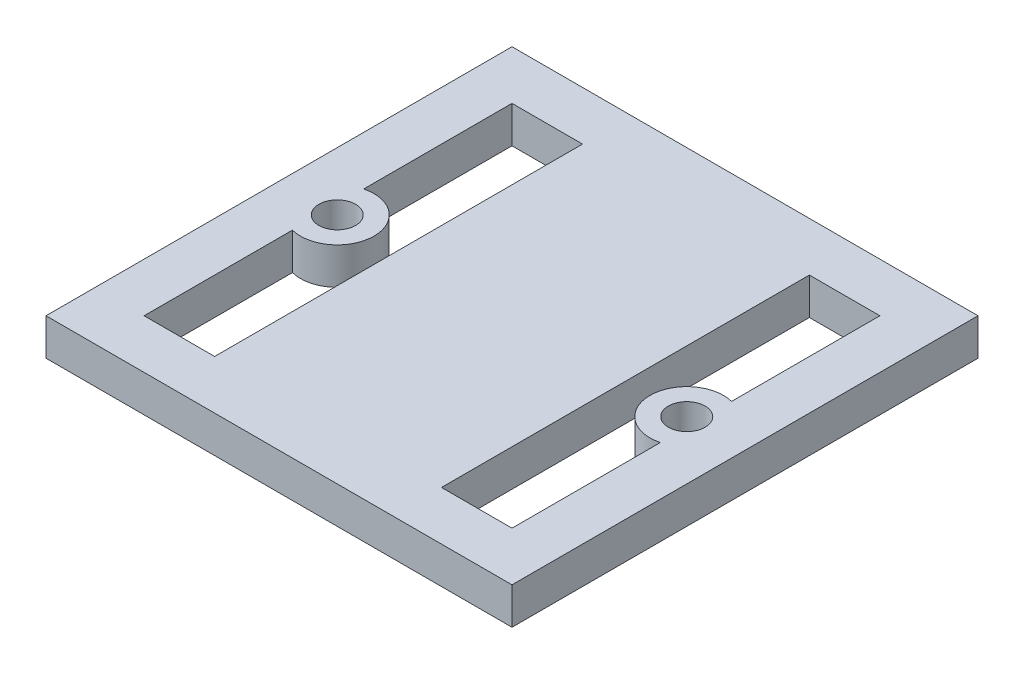
ISO-10303-21;
HEADER;
FILE_DESCRIPTION(('STEP AP214'),'2;1');
FILE_NAME('part.step','',(''),(''),'','','');
FILE_SCHEMA(('AUTOMOTIVE_DESIGN { 1 0 10303 214 1 1 1 1 }'));
ENDSEC;
DATA;
#1=APPLICATION_CONTEXT('core data for automotive mechanical design processes');
#2=APPLICATION_PROTOCOL_DEFINITION('international standard','automotive_design',2000,#1);
#3=PRODUCT_CONTEXT('',#1,'mechanical');
#4=PRODUCT('Part','Part','',(#3));
#5=PRODUCT_RELATED_PRODUCT_CATEGORY('part','',(#4));
#6=PRODUCT_DEFINITION_FORMATION('','',#4);
#7=PRODUCT_DEFINITION_CONTEXT('part definition',#1,'design');
#8=PRODUCT_DEFINITION('design','',#6,#7);
#9=PRODUCT_DEFINITION_SHAPE('','',#8);
#10=(LENGTH_UNIT() NAMED_UNIT(*) SI_UNIT(.MILLI.,.METRE.));
#11=(NAMED_UNIT(*) PLANE_ANGLE_UNIT() SI_UNIT($,.RADIAN.));
#12=(NAMED_UNIT(*) SI_UNIT($,.STERADIAN.) SOLID_ANGLE_UNIT());
#13=UNCERTAINTY_MEASURE_WITH_UNIT(LENGTH_MEASURE(1.E-05),#10,'distance_accuracy_value','');
#14=(GEOMETRIC_REPRESENTATION_CONTEXT(3) GLOBAL_UNCERTAINTY_ASSIGNED_CONTEXT((#13)) GLOBAL_UNIT_ASSIGNED_CONTEXT((#10,
#11,#12)) REPRESENTATION_CONTEXT('',''));
#15=CARTESIAN_POINT('',(0.,0.,0.));
#16=DIRECTION('',(0.,0.,1.));
#17=DIRECTION('',(1.,0.,0.));
#18=AXIS2_PLACEMENT_3D('',#15,#16,#17);
#19=CARTESIAN_POINT('',(0.,3.,19.));
#20=DIRECTION('',(0.,0.,-1.));
#21=DIRECTION('',(-1.,0.,0.));
#22=AXIS2_PLACEMENT_3D('',#19,#20,#21);
#23=PLANE('',#22);
#24=DIRECTION('',(1.,0.,0.));
#25=VECTOR('',#24,1.);
#26=CARTESIAN_POINT('',(0.,0.,19.));
#27=LINE('',#26,#25);
#28=CARTESIAN_POINT('',(-19.,0.,19.));
#29=VERTEX_POINT('',#28);
#30=CARTESIAN_POINT('',(19.,0.,19.));
#31=VERTEX_POINT('',#30);
#32=EDGE_CURVE('E237',#29,#31,#27,.T.);
#33=ORIENTED_EDGE('',*,*,#32,.T.);
#34=DIRECTION('',(0.,-1.,0.));
#35=VECTOR('',#34,1.);
#36=CARTESIAN_POINT('',(19.,3.,19.));
#37=LINE('',#36,#35);
#38=CARTESIAN_POINT('',(19.,3.,19.));
#39=VERTEX_POINT('',#38);
#40=EDGE_CURVE('E11',#39,#31,#37,.T.);
#41=ORIENTED_EDGE('',*,*,#40,.F.);
#42=DIRECTION('',(1.,0.,0.));
#43=VECTOR('',#42,1.);
#44=CARTESIAN_POINT('',(0.,3.,19.));
#45=LINE('',#44,#43);
#46=CARTESIAN_POINT('',(-19.,3.,19.));
#47=VERTEX_POINT('',#46);
#48=EDGE_CURVE('E173',#47,#39,#45,.T.);
#49=ORIENTED_EDGE('',*,*,#48,.F.);
#50=DIRECTION('',(0.,-1.,0.));
#51=VECTOR('',#50,1.);
#52=CARTESIAN_POINT('',(-19.,3.,19.));
#53=LINE('',#52,#51);
#54=EDGE_CURVE('E64',#47,#29,#53,.T.);
#55=ORIENTED_EDGE('',*,*,#54,.T.);
#56=EDGE_LOOP('',(#33,#41,#49,#55));
#57=FACE_BOUND('',#56,.T.);
#58=ADVANCED_FACE('F44',(#57),#23,.F.);
#59=CARTESIAN_POINT('',(19.,3.,0.));
#60=DIRECTION('',(-1.,0.,0.));
#61=DIRECTION('',(0.,0.,1.));
#62=AXIS2_PLACEMENT_3D('',#59,#60,#61);
#63=PLANE('',#62);
#64=DIRECTION('',(0.,0.,-1.));
#65=VECTOR('',#64,1.);
#66=CARTESIAN_POINT('',(19.,0.,0.));
#67=LINE('',#66,#65);
#68=CARTESIAN_POINT('',(19.,0.,-19.));
#69=VERTEX_POINT('',#68);
#70=EDGE_CURVE('E180',#31,#69,#67,.T.);
#71=ORIENTED_EDGE('',*,*,#70,.T.);
#72=DIRECTION('',(0.,-1.,0.));
#73=VECTOR('',#72,1.);
#74=CARTESIAN_POINT('',(19.,3.,-19.));
#75=LINE('',#74,#73);
#76=CARTESIAN_POINT('',(19.,3.,-19.));
#77=VERTEX_POINT('',#76);
#78=EDGE_CURVE('E55',#77,#69,#75,.T.);
#79=ORIENTED_EDGE('',*,*,#78,.F.);
#80=DIRECTION('',(0.,0.,-1.));
#81=VECTOR('',#80,1.);
#82=CARTESIAN_POINT('',(19.,3.,0.));
#83=LINE('',#82,#81);
#84=EDGE_CURVE('E167',#39,#77,#83,.T.);
#85=ORIENTED_EDGE('',*,*,#84,.F.);
#86=ORIENTED_EDGE('',*,*,#40,.T.);
#87=EDGE_LOOP('',(#71,#79,#85,#86));
#88=FACE_BOUND('',#87,.T.);
#89=ADVANCED_FACE('F179',(#88),#63,.F.);
#90=CARTESIAN_POINT('',(0.,3.,-19.));
#91=DIRECTION('',(0.,0.,-1.));
#92=DIRECTION('',(-1.,0.,0.));
#93=AXIS2_PLACEMENT_3D('',#90,#91,#92);
#94=PLANE('',#93);
#95=DIRECTION('',(1.,0.,0.));
#96=VECTOR('',#95,1.);
#97=CARTESIAN_POINT('',(0.,0.,-19.));
#98=LINE('',#97,#96);
#99=CARTESIAN_POINT('',(-19.,0.,-19.));
#100=VERTEX_POINT('',#99);
#101=EDGE_CURVE('E242',#100,#69,#98,.T.);
#102=ORIENTED_EDGE('',*,*,#101,.F.);
#103=DIRECTION('',(0.,-1.,0.));
#104=VECTOR('',#103,1.);
#105=CARTESIAN_POINT('',(-19.,3.,-19.));
#106=LINE('',#105,#104);
#107=CARTESIAN_POINT('',(-19.,3.,-19.));
#108=VERTEX_POINT('',#107);
#109=EDGE_CURVE('E114',#108,#100,#106,.T.);
#110=ORIENTED_EDGE('',*,*,#109,.F.);
#111=DIRECTION('',(1.,0.,0.));
#112=VECTOR('',#111,1.);
#113=CARTESIAN_POINT('',(0.,3.,-19.));
#114=LINE('',#113,#112);
#115=EDGE_CURVE('E172',#108,#77,#114,.T.);
#116=ORIENTED_EDGE('',*,*,#115,.T.);
#117=ORIENTED_EDGE('',*,*,#78,.T.);
#118=EDGE_LOOP('',(#102,#110,#116,#117));
#119=FACE_BOUND('',#118,.T.);
#120=ADVANCED_FACE('F185',(#119),#94,.T.);
#121=CARTESIAN_POINT('',(0.,3.,15.));
#122=DIRECTION('',(0.,0.,-1.));
#123=DIRECTION('',(-1.,0.,0.));
#124=AXIS2_PLACEMENT_3D('',#121,#122,#123);
#125=PLANE('',#124);
#126=DIRECTION('',(1.,0.,0.));
#127=VECTOR('',#126,1.);
#128=CARTESIAN_POINT('',(0.,0.,15.));
#129=LINE('',#128,#127);
#130=CARTESIAN_POINT('',(9.25,0.,15.));
#131=VERTEX_POINT('',#130);
#132=CARTESIAN_POINT('',(15.,0.,15.));
#133=VERTEX_POINT('',#132);
#134=EDGE_CURVE('E219',#131,#133,#129,.T.);
#135=ORIENTED_EDGE('',*,*,#134,.F.);
#136=DIRECTION('',(0.,-1.,0.));
#137=VECTOR('',#136,1.);
#138=CARTESIAN_POINT('',(9.25,3.,15.));
#139=LINE('',#138,#137);
#140=CARTESIAN_POINT('',(9.25,3.,15.));
#141=VERTEX_POINT('',#140);
#142=EDGE_CURVE('E252',#141,#131,#139,.T.);
#143=ORIENTED_EDGE('',*,*,#142,.F.);
#144=DIRECTION('',(1.,0.,0.));
#145=VECTOR('',#144,1.);
#146=CARTESIAN_POINT('',(0.,3.,15.));
#147=LINE('',#146,#145);
#148=CARTESIAN_POINT('',(15.,3.,15.));
#149=VERTEX_POINT('',#148);
#150=EDGE_CURVE('E322',#141,#149,#147,.T.);
#151=ORIENTED_EDGE('',*,*,#150,.T.);
#152=DIRECTION('',(0.,-1.,0.));
#153=VECTOR('',#152,1.);
#154=CARTESIAN_POINT('',(15.,3.,15.));
#155=LINE('',#154,#153);
#156=EDGE_CURVE('E255',#149,#133,#155,.T.);
#157=ORIENTED_EDGE('',*,*,#156,.T.);
#158=EDGE_LOOP('',(#135,#143,#151,#157));
#159=FACE_BOUND('',#158,.T.);
#160=ADVANCED_FACE('F420',(#159),#125,.T.);
#161=CARTESIAN_POINT('',(9.25,3.,0.));
#162=DIRECTION('',(-1.,0.,0.));
#163=DIRECTION('',(0.,0.,1.));
#164=AXIS2_PLACEMENT_3D('',#161,#162,#163);
#165=PLANE('',#164);
#166=DIRECTION('',(0.,0.,-1.));
#167=VECTOR('',#166,1.);
#168=CARTESIAN_POINT('',(9.25,0.,0.));
#169=LINE('',#168,#167);
#170=CARTESIAN_POINT('',(9.25,0.,-15.));
#171=VERTEX_POINT('',#170);
#172=EDGE_CURVE('E224',#131,#171,#169,.T.);
#173=ORIENTED_EDGE('',*,*,#172,.T.);
#174=DIRECTION('',(0.,-1.,0.));
#175=VECTOR('',#174,1.);
#176=CARTESIAN_POINT('',(9.25,3.,-15.));
#177=LINE('',#176,#175);
#178=CARTESIAN_POINT('',(9.25,3.,-15.));
#179=VERTEX_POINT('',#178);
#180=EDGE_CURVE('E267',#179,#171,#177,.T.);
#181=ORIENTED_EDGE('',*,*,#180,.F.);
#182=DIRECTION('',(0.,0.,-1.));
#183=VECTOR('',#182,1.);
#184=CARTESIAN_POINT('',(9.25,3.,0.));
#185=LINE('',#184,#183);
#186=EDGE_CURVE('E331',#141,#179,#185,.T.);
#187=ORIENTED_EDGE('',*,*,#186,.F.);
#188=ORIENTED_EDGE('',*,*,#142,.T.);
#189=EDGE_LOOP('',(#173,#181,#187,#188));
#190=FACE_BOUND('',#189,.T.);
#191=ADVANCED_FACE('F416',(#190),#165,.F.);
#192=CARTESIAN_POINT('',(0.,3.,-15.));
#193=DIRECTION('',(0.,0.,-1.));
#194=DIRECTION('',(-1.,0.,0.));
#195=AXIS2_PLACEMENT_3D('',#192,#193,#194);
#196=PLANE('',#195);
#197=DIRECTION('',(1.,0.,0.));
#198=VECTOR('',#197,1.);
#199=CARTESIAN_POINT('',(0.,0.,-15.));
#200=LINE('',#199,#198);
#201=CARTESIAN_POINT('',(15.,0.,-15.));
#202=VERTEX_POINT('',#201);
#203=EDGE_CURVE('E211',#171,#202,#200,.T.);
#204=ORIENTED_EDGE('',*,*,#203,.T.);
#205=DIRECTION('',(0.,-1.,0.));
#206=VECTOR('',#205,1.);
#207=CARTESIAN_POINT('',(15.,3.,-15.));
#208=LINE('',#207,#206);
#209=CARTESIAN_POINT('',(15.,3.,-15.));
#210=VERTEX_POINT('',#209);
#211=EDGE_CURVE('E264',#210,#202,#208,.T.);
#212=ORIENTED_EDGE('',*,*,#211,.F.);
#213=DIRECTION('',(1.,0.,0.));
#214=VECTOR('',#213,1.);
#215=CARTESIAN_POINT('',(0.,3.,-15.));
#216=LINE('',#215,#214);
#217=EDGE_CURVE('E324',#179,#210,#216,.T.);
#218=ORIENTED_EDGE('',*,*,#217,.F.);
#219=ORIENTED_EDGE('',*,*,#180,.T.);
#220=EDGE_LOOP('',(#204,#212,#218,#219));
#221=FACE_BOUND('',#220,.T.);
#222=ADVANCED_FACE('F413',(#221),#196,.F.);
#223=CARTESIAN_POINT('',(15.,3.,0.));
#224=DIRECTION('',(-1.,0.,0.));
#225=DIRECTION('',(0.,0.,1.));
#226=AXIS2_PLACEMENT_3D('',#223,#224,#225);
#227=PLANE('',#226);
#228=DIRECTION('',(0.,0.,-1.));
#229=VECTOR('',#228,1.);
#230=CARTESIAN_POINT('',(15.,0.,0.));
#231=LINE('',#230,#229);
#232=CARTESIAN_POINT('',(15.,0.,-2.90473750965557));
#233=VERTEX_POINT('',#232);
#234=EDGE_CURVE('E228',#233,#202,#231,.T.);
#235=ORIENTED_EDGE('',*,*,#234,.F.);
#236=DIRECTION('',(0.,-1.,0.));
#237=VECTOR('',#236,1.);
#238=CARTESIAN_POINT('',(15.,3.,-2.90473750965557));
#239=LINE('',#238,#237);
#240=CARTESIAN_POINT('',(15.,3.,-2.90473750965557));
#241=VERTEX_POINT('',#240);
#242=EDGE_CURVE('E261',#241,#233,#239,.T.);
#243=ORIENTED_EDGE('',*,*,#242,.F.);
#244=DIRECTION('',(0.,0.,-1.));
#245=VECTOR('',#244,1.);
#246=CARTESIAN_POINT('',(15.,3.,0.));
#247=LINE('',#246,#245);
#248=EDGE_CURVE('E335',#241,#210,#247,.T.);
#249=ORIENTED_EDGE('',*,*,#248,.T.);
#250=ORIENTED_EDGE('',*,*,#211,.T.);
#251=EDGE_LOOP('',(#235,#243,#249,#250));
#252=FACE_BOUND('',#251,.T.);
#253=ADVANCED_FACE('F410',(#252),#227,.T.);
#254=CARTESIAN_POINT('',(14.25,3.,0.));
#255=DIRECTION('',(0.,-1.,0.));
#256=DIRECTION('',(0.,0.,-1.));
#257=AXIS2_PLACEMENT_3D('',#254,#255,#256);
#258=CYLINDRICAL_SURFACE('',#257,3.);
#259=CARTESIAN_POINT('',(14.25,0.,0.));
#260=DIRECTION('',(0.,1.,0.));
#261=DIRECTION('',(0.,0.,1.));
#262=AXIS2_PLACEMENT_3D('',#259,#260,#261);
#263=CIRCLE('',#262,3.);
#264=CARTESIAN_POINT('',(15.,0.,2.90473750965556));
#265=VERTEX_POINT('',#264);
#266=EDGE_CURVE('E232',#233,#265,#263,.T.);
#267=ORIENTED_EDGE('',*,*,#266,.T.);
#268=DIRECTION('',(0.,-1.,0.));
#269=VECTOR('',#268,1.);
#270=CARTESIAN_POINT('',(15.,3.,2.90473750965556));
#271=LINE('',#270,#269);
#272=CARTESIAN_POINT('',(15.,3.,2.90473750965556));
#273=VERTEX_POINT('',#272);
#274=EDGE_CURVE('E258',#273,#265,#271,.T.);
#275=ORIENTED_EDGE('',*,*,#274,.F.);
#276=CARTESIAN_POINT('',(14.25,3.,0.));
#277=DIRECTION('',(0.,1.,0.));
#278=DIRECTION('',(0.,0.,1.));
#279=AXIS2_PLACEMENT_3D('',#276,#277,#278);
#280=CIRCLE('',#279,3.);
#281=EDGE_CURVE('E339',#241,#273,#280,.T.);
#282=ORIENTED_EDGE('',*,*,#281,.F.);
#283=ORIENTED_EDGE('',*,*,#242,.T.);
#284=EDGE_LOOP('',(#267,#275,#282,#283));
#285=FACE_BOUND('',#284,.T.);
#286=ADVANCED_FACE('F356',(#285),#258,.T.);
#287=CARTESIAN_POINT('',(-14.25,3.,0.));
#288=DIRECTION('',(0.,-1.,0.));
#289=DIRECTION('',(0.,0.,-1.));
#290=AXIS2_PLACEMENT_3D('',#287,#288,#289);
#291=CYLINDRICAL_SURFACE('',#290,3.);
#292=CARTESIAN_POINT('',(-14.25,0.,0.));
#293=DIRECTION('',(0.,1.,0.));
#294=DIRECTION('',(0.,0.,1.));
#295=AXIS2_PLACEMENT_3D('',#292,#293,#294);
#296=CIRCLE('',#295,3.);
#297=CARTESIAN_POINT('',(-15.,0.,2.90473750965556));
#298=VERTEX_POINT('',#297);
#299=CARTESIAN_POINT('',(-15.,0.,-2.90473750965556));
#300=VERTEX_POINT('',#299);
#301=EDGE_CURVE('E198',#298,#300,#296,.T.);
#302=ORIENTED_EDGE('',*,*,#301,.T.);
#303=DIRECTION('',(0.,-1.,0.));
#304=VECTOR('',#303,1.);
#305=CARTESIAN_POINT('',(-15.,3.,-2.90473750965556));
#306=LINE('',#305,#304);
#307=CARTESIAN_POINT('',(-15.,3.,-2.90473750965556));
#308=VERTEX_POINT('',#307);
#309=EDGE_CURVE('E48',#308,#300,#306,.T.);
#310=ORIENTED_EDGE('',*,*,#309,.F.);
#311=CARTESIAN_POINT('',(-14.25,3.,0.));
#312=DIRECTION('',(0.,1.,0.));
#313=DIRECTION('',(0.,0.,1.));
#314=AXIS2_PLACEMENT_3D('',#311,#312,#313);
#315=CIRCLE('',#314,3.);
#316=CARTESIAN_POINT('',(-15.,3.,2.90473750965556));
#317=VERTEX_POINT('',#316);
#318=EDGE_CURVE('E376',#317,#308,#315,.T.);
#319=ORIENTED_EDGE('',*,*,#318,.F.);
#320=DIRECTION('',(0.,-1.,0.));
#321=VECTOR('',#320,1.);
#322=CARTESIAN_POINT('',(-15.,3.,2.90473750965556));
#323=LINE('',#322,#321);
#324=EDGE_CURVE('E190',#317,#298,#323,.T.);
#325=ORIENTED_EDGE('',*,*,#324,.T.);
#326=EDGE_LOOP('',(#302,#310,#319,#325));
#327=FACE_BOUND('',#326,.T.);
#328=ADVANCED_FACE('F296',(#327),#291,.T.);
#329=CARTESIAN_POINT('',(-15.,3.,0.));
#330=DIRECTION('',(-1.,0.,0.));
#331=DIRECTION('',(0.,0.,1.));
#332=AXIS2_PLACEMENT_3D('',#329,#330,#331);
#333=PLANE('',#332);
#334=DIRECTION('',(0.,0.,-1.));
#335=VECTOR('',#334,1.);
#336=CARTESIAN_POINT('',(-15.,0.,0.));
#337=LINE('',#336,#335);
#338=CARTESIAN_POINT('',(-15.,0.,-15.));
#339=VERTEX_POINT('',#338);
#340=EDGE_CURVE('E202',#300,#339,#337,.T.);
#341=ORIENTED_EDGE('',*,*,#340,.T.);
#342=DIRECTION('',(0.,-1.,0.));
#343=VECTOR('',#342,1.);
#344=CARTESIAN_POINT('',(-15.,3.,-15.));
#345=LINE('',#344,#343);
#346=CARTESIAN_POINT('',(-15.,3.,-15.));
#347=VERTEX_POINT('',#346);
#348=EDGE_CURVE('E284',#347,#339,#345,.T.);
#349=ORIENTED_EDGE('',*,*,#348,.F.);
#350=DIRECTION('',(0.,0.,-1.));
#351=VECTOR('',#350,1.);
#352=CARTESIAN_POINT('',(-15.,3.,0.));
#353=LINE('',#352,#351);
#354=EDGE_CURVE('E127',#308,#347,#353,.T.);
#355=ORIENTED_EDGE('',*,*,#354,.F.);
#356=ORIENTED_EDGE('',*,*,#309,.T.);
#357=EDGE_LOOP('',(#341,#349,#355,#356));
#358=FACE_BOUND('',#357,.T.);
#359=ADVANCED_FACE('F292',(#358),#333,.F.);
#360=CARTESIAN_POINT('',(-9.25,0.,-15.));
#361=VERTEX_POINT('',#360);
#362=EDGE_CURVE('E205',#339,#361,#200,.T.);
#363=ORIENTED_EDGE('',*,*,#362,.T.);
#364=DIRECTION('',(0.,-1.,0.));
#365=VECTOR('',#364,1.);
#366=CARTESIAN_POINT('',(-9.25,3.,-15.));
#367=LINE('',#366,#365);
#368=CARTESIAN_POINT('',(-9.25,3.,-15.));
#369=VERTEX_POINT('',#368);
#370=EDGE_CURVE('E282',#369,#361,#367,.T.);
#371=ORIENTED_EDGE('',*,*,#370,.F.);
#372=EDGE_CURVE('E307',#347,#369,#216,.T.);
#373=ORIENTED_EDGE('',*,*,#372,.F.);
#374=ORIENTED_EDGE('',*,*,#348,.T.);
#375=EDGE_LOOP('',(#363,#371,#373,#374));
#376=FACE_BOUND('',#375,.T.);
#377=ADVANCED_FACE('F305',(#376),#196,.F.);
#378=CARTESIAN_POINT('',(-9.25,3.,0.));
#379=DIRECTION('',(-1.,0.,0.));
#380=DIRECTION('',(0.,0.,1.));
#381=AXIS2_PLACEMENT_3D('',#378,#379,#380);
#382=PLANE('',#381);
#383=DIRECTION('',(0.,0.,-1.));
#384=VECTOR('',#383,1.);
#385=CARTESIAN_POINT('',(-9.25,0.,0.));
#386=LINE('',#385,#384);
#387=CARTESIAN_POINT('',(-9.25,0.,15.));
#388=VERTEX_POINT('',#387);
#389=EDGE_CURVE('E210',#388,#361,#386,.T.);
#390=ORIENTED_EDGE('',*,*,#389,.F.);
#391=DIRECTION('',(0.,-1.,0.));
#392=VECTOR('',#391,1.);
#393=CARTESIAN_POINT('',(-9.25,3.,15.));
#394=LINE('',#393,#392);
#395=CARTESIAN_POINT('',(-9.25,3.,15.));
#396=VERTEX_POINT('',#395);
#397=EDGE_CURVE('E279',#396,#388,#394,.T.);
#398=ORIENTED_EDGE('',*,*,#397,.F.);
#399=DIRECTION('',(0.,0.,-1.));
#400=VECTOR('',#399,1.);
#401=CARTESIAN_POINT('',(-9.25,3.,0.));
#402=LINE('',#401,#400);
#403=EDGE_CURVE('E310',#396,#369,#402,.T.);
#404=ORIENTED_EDGE('',*,*,#403,.T.);
#405=ORIENTED_EDGE('',*,*,#370,.T.);
#406=EDGE_LOOP('',(#390,#398,#404,#405));
#407=FACE_BOUND('',#406,.T.);
#408=ADVANCED_FACE('F311',(#407),#382,.T.);
#409=CARTESIAN_POINT('',(-15.,0.,15.));
#410=VERTEX_POINT('',#409);
#411=EDGE_CURVE('E215',#410,#388,#129,.T.);
#412=ORIENTED_EDGE('',*,*,#411,.F.);
#413=DIRECTION('',(0.,-1.,0.));
#414=VECTOR('',#413,1.);
#415=CARTESIAN_POINT('',(-15.,3.,15.));
#416=LINE('',#415,#414);
#417=CARTESIAN_POINT('',(-15.,3.,15.));
#418=VERTEX_POINT('',#417);
#419=EDGE_CURVE('E276',#418,#410,#416,.T.);
#420=ORIENTED_EDGE('',*,*,#419,.F.);
#421=EDGE_CURVE('E316',#418,#396,#147,.T.);
#422=ORIENTED_EDGE('',*,*,#421,.T.);
#423=ORIENTED_EDGE('',*,*,#397,.T.);
#424=EDGE_LOOP('',(#412,#420,#422,#423));
#425=FACE_BOUND('',#424,.T.);
#426=ADVANCED_FACE('F374',(#425),#125,.T.);
#427=EDGE_CURVE('E233',#133,#265,#231,.T.);
#428=ORIENTED_EDGE('',*,*,#427,.F.);
#429=ORIENTED_EDGE('',*,*,#156,.F.);
#430=EDGE_CURVE('E340',#149,#273,#247,.T.);
#431=ORIENTED_EDGE('',*,*,#430,.T.);
#432=ORIENTED_EDGE('',*,*,#274,.T.);
#433=EDGE_LOOP('',(#428,#429,#431,#432));
#434=FACE_BOUND('',#433,.T.);
#435=ADVANCED_FACE('F348',(#434),#227,.T.);
#436=CARTESIAN_POINT('',(-14.25,3.,0.));
#437=DIRECTION('',(0.,-1.,0.));
#438=DIRECTION('',(0.,0.,-1.));
#439=AXIS2_PLACEMENT_3D('',#436,#437,#438);
#440=CYLINDRICAL_SURFACE('',#439,1.5);
#441=CARTESIAN_POINT('',(-14.25,3.,0.));
#442=DIRECTION('',(0.,1.,0.));
#443=DIRECTION('',(0.,0.,1.));
#444=AXIS2_PLACEMENT_3D('',#441,#442,#443);
#445=CIRCLE('',#444,1.5);
#446=CARTESIAN_POINT('',(-14.25,3.,1.5));
#447=VERTEX_POINT('',#446);
#448=EDGE_CURVE('E327',#447,#447,#445,.T.);
#449=ORIENTED_EDGE('',*,*,#448,.T.);
#450=EDGE_LOOP('',(#449));
#451=FACE_BOUND('',#450,.T.);
#452=CARTESIAN_POINT('',(-14.25,0.,0.));
#453=DIRECTION('',(0.,1.,0.));
#454=DIRECTION('',(0.,0.,1.));
#455=AXIS2_PLACEMENT_3D('',#452,#453,#454);
#456=CIRCLE('',#455,1.5);
#457=CARTESIAN_POINT('',(-14.25,0.,1.5));
#458=VERTEX_POINT('',#457);
#459=EDGE_CURVE('E220',#458,#458,#456,.T.);
#460=ORIENTED_EDGE('',*,*,#459,.F.);
#461=EDGE_LOOP('',(#460));
#462=FACE_BOUND('',#461,.T.);
#463=ADVANCED_FACE('F409',(#451,#462),#440,.F.);
#464=EDGE_CURVE('E206',#410,#298,#337,.T.);
#465=ORIENTED_EDGE('',*,*,#464,.T.);
#466=ORIENTED_EDGE('',*,*,#324,.F.);
#467=EDGE_CURVE('E320',#418,#317,#353,.T.);
#468=ORIENTED_EDGE('',*,*,#467,.F.);
#469=ORIENTED_EDGE('',*,*,#419,.T.);
#470=EDGE_LOOP('',(#465,#466,#468,#469));
#471=FACE_BOUND('',#470,.T.);
#472=ADVANCED_FACE('F371',(#471),#333,.F.);
#473=CARTESIAN_POINT('',(14.25,3.,0.));
#474=DIRECTION('',(0.,-1.,0.));
#475=DIRECTION('',(0.,0.,-1.));
#476=AXIS2_PLACEMENT_3D('',#473,#474,#475);
#477=CYLINDRICAL_SURFACE('',#476,1.5);
#478=CARTESIAN_POINT('',(14.25,3.,0.));
#479=DIRECTION('',(0.,1.,0.));
#480=DIRECTION('',(0.,0.,1.));
#481=AXIS2_PLACEMENT_3D('',#478,#479,#480);
#482=CIRCLE('',#481,1.5);
#483=CARTESIAN_POINT('',(14.25,3.,1.5));
#484=VERTEX_POINT('',#483);
#485=EDGE_CURVE('E249',#484,#484,#482,.F.);
#486=ORIENTED_EDGE('',*,*,#485,.F.);
#487=EDGE_LOOP('',(#486));
#488=FACE_BOUND('',#487,.T.);
#489=CARTESIAN_POINT('',(14.25,0.,0.));
#490=DIRECTION('',(0.,1.,0.));
#491=DIRECTION('',(0.,0.,1.));
#492=AXIS2_PLACEMENT_3D('',#489,#490,#491);
#493=CIRCLE('',#492,1.5);
#494=CARTESIAN_POINT('',(14.25,0.,1.5));
#495=VERTEX_POINT('',#494);
#496=EDGE_CURVE('E194',#495,#495,#493,.F.);
#497=ORIENTED_EDGE('',*,*,#496,.T.);
#498=EDGE_LOOP('',(#497));
#499=FACE_BOUND('',#498,.T.);
#500=ADVANCED_FACE('F46',(#488,#499),#477,.F.);
#501=CARTESIAN_POINT('',(-19.,3.,0.));
#502=DIRECTION('',(-1.,0.,0.));
#503=DIRECTION('',(0.,0.,1.));
#504=AXIS2_PLACEMENT_3D('',#501,#502,#503);
#505=PLANE('',#504);
#506=DIRECTION('',(0.,0.,-1.));
#507=VECTOR('',#506,1.);
#508=CARTESIAN_POINT('',(-19.,0.,0.));
#509=LINE('',#508,#507);
#510=EDGE_CURVE('E245',#29,#100,#509,.T.);
#511=ORIENTED_EDGE('',*,*,#510,.F.);
#512=ORIENTED_EDGE('',*,*,#54,.F.);
#513=DIRECTION('',(0.,0.,-1.));
#514=VECTOR('',#513,1.);
#515=CARTESIAN_POINT('',(-19.,3.,0.));
#516=LINE('',#515,#514);
#517=EDGE_CURVE('E187',#47,#108,#516,.T.);
#518=ORIENTED_EDGE('',*,*,#517,.T.);
#519=ORIENTED_EDGE('',*,*,#109,.T.);
#520=EDGE_LOOP('',(#511,#512,#518,#519));
#521=FACE_BOUND('',#520,.T.);
#522=ADVANCED_FACE('F389',(#521),#505,.T.);
#523=CARTESIAN_POINT('',(0.,3.,0.));
#524=DIRECTION('',(0.,1.,0.));
#525=DIRECTION('',(0.,0.,1.));
#526=AXIS2_PLACEMENT_3D('',#523,#524,#525);
#527=PLANE('',#526);
#528=ORIENTED_EDGE('',*,*,#485,.T.);
#529=EDGE_LOOP('',(#528));
#530=FACE_BOUND('',#529,.T.);
#531=ORIENTED_EDGE('',*,*,#318,.T.);
#532=ORIENTED_EDGE('',*,*,#354,.T.);
#533=ORIENTED_EDGE('',*,*,#372,.T.);
#534=ORIENTED_EDGE('',*,*,#403,.F.);
#535=ORIENTED_EDGE('',*,*,#421,.F.);
#536=ORIENTED_EDGE('',*,*,#467,.T.);
#537=EDGE_LOOP('',(#531,#532,#533,#534,#535,#536));
#538=FACE_BOUND('',#537,.T.);
#539=ORIENTED_EDGE('',*,*,#448,.F.);
#540=EDGE_LOOP('',(#539));
#541=FACE_BOUND('',#540,.T.);
#542=ORIENTED_EDGE('',*,*,#150,.F.);
#543=ORIENTED_EDGE('',*,*,#186,.T.);
#544=ORIENTED_EDGE('',*,*,#217,.T.);
#545=ORIENTED_EDGE('',*,*,#248,.F.);
#546=ORIENTED_EDGE('',*,*,#281,.T.);
#547=ORIENTED_EDGE('',*,*,#430,.F.);
#548=EDGE_LOOP('',(#542,#543,#544,#545,#546,#547));
#549=FACE_BOUND('',#548,.T.);
#550=ORIENTED_EDGE('',*,*,#48,.T.);
#551=ORIENTED_EDGE('',*,*,#84,.T.);
#552=ORIENTED_EDGE('',*,*,#115,.F.);
#553=ORIENTED_EDGE('',*,*,#517,.F.);
#554=EDGE_LOOP('',(#550,#551,#552,#553));
#555=FACE_BOUND('',#554,.T.);
#556=ADVANCED_FACE('F169',(#530,#538,#541,#549,#555),#527,.T.);
#557=CARTESIAN_POINT('',(0.,0.,0.));
#558=DIRECTION('',(0.,1.,0.));
#559=DIRECTION('',(0.,0.,1.));
#560=AXIS2_PLACEMENT_3D('',#557,#558,#559);
#561=PLANE('',#560);
#562=ORIENTED_EDGE('',*,*,#496,.F.);
#563=EDGE_LOOP('',(#562));
#564=FACE_BOUND('',#563,.T.);
#565=ORIENTED_EDGE('',*,*,#301,.F.);
#566=ORIENTED_EDGE('',*,*,#464,.F.);
#567=ORIENTED_EDGE('',*,*,#411,.T.);
#568=ORIENTED_EDGE('',*,*,#389,.T.);
#569=ORIENTED_EDGE('',*,*,#362,.F.);
#570=ORIENTED_EDGE('',*,*,#340,.F.);
#571=EDGE_LOOP('',(#565,#566,#567,#568,#569,#570));
#572=FACE_BOUND('',#571,.T.);
#573=ORIENTED_EDGE('',*,*,#459,.T.);
#574=EDGE_LOOP('',(#573));
#575=FACE_BOUND('',#574,.T.);
#576=ORIENTED_EDGE('',*,*,#134,.T.);
#577=ORIENTED_EDGE('',*,*,#427,.T.);
#578=ORIENTED_EDGE('',*,*,#266,.F.);
#579=ORIENTED_EDGE('',*,*,#234,.T.);
#580=ORIENTED_EDGE('',*,*,#203,.F.);
#581=ORIENTED_EDGE('',*,*,#172,.F.);
#582=EDGE_LOOP('',(#576,#577,#578,#579,#580,#581));
#583=FACE_BOUND('',#582,.T.);
#584=ORIENTED_EDGE('',*,*,#32,.F.);
#585=ORIENTED_EDGE('',*,*,#510,.T.);
#586=ORIENTED_EDGE('',*,*,#101,.T.);
#587=ORIENTED_EDGE('',*,*,#70,.F.);
#588=EDGE_LOOP('',(#584,#585,#586,#587));
#589=FACE_BOUND('',#588,.T.);
#590=ADVANCED_FACE('F300',(#564,#572,#575,#583,#589),#561,.F.);
#591=CLOSED_SHELL('',(#58,#89,#120,#160,#191,#222,#253,#286,#328,#359,#377,#408,#426,#435,#463,
#472,#500,#522,#556,#590));
#592=MANIFOLD_SOLID_BREP('B2',#591);
#593=ADVANCED_BREP_SHAPE_REPRESENTATION('',(#18,#592),#14);
#594=SHAPE_DEFINITION_REPRESENTATION(#9,#593);
ENDSEC;
END-ISO-10303-21;
